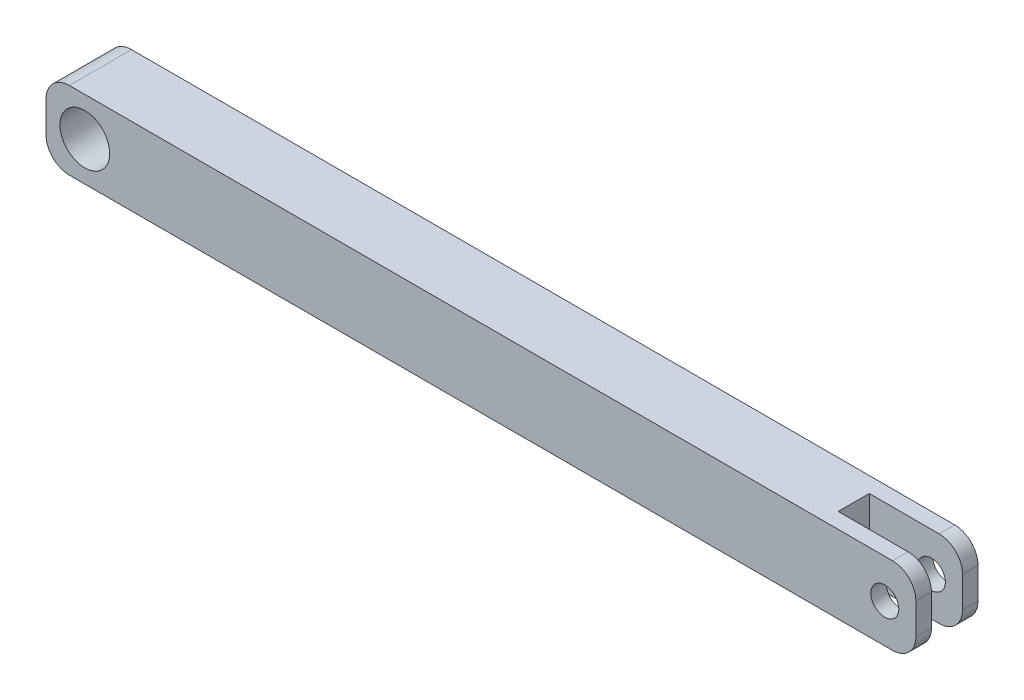
ISO-10303-21;
HEADER;
FILE_DESCRIPTION(('STEP AP214'),'2;1');
FILE_NAME('part.step','',(''),(''),'','','');
FILE_SCHEMA(('AUTOMOTIVE_DESIGN { 1 0 10303 214 1 1 1 1 }'));
ENDSEC;
DATA;
#1=APPLICATION_CONTEXT('core data for automotive mechanical design processes');
#2=APPLICATION_PROTOCOL_DEFINITION('international standard','automotive_design',2000,#1);
#3=PRODUCT_CONTEXT('',#1,'mechanical');
#4=PRODUCT('Part','Part','',(#3));
#5=PRODUCT_RELATED_PRODUCT_CATEGORY('part','',(#4));
#6=PRODUCT_DEFINITION_FORMATION('','',#4);
#7=PRODUCT_DEFINITION_CONTEXT('part definition',#1,'design');
#8=PRODUCT_DEFINITION('design','',#6,#7);
#9=PRODUCT_DEFINITION_SHAPE('','',#8);
#10=(LENGTH_UNIT() NAMED_UNIT(*) SI_UNIT(.MILLI.,.METRE.));
#11=(NAMED_UNIT(*) PLANE_ANGLE_UNIT() SI_UNIT($,.RADIAN.));
#12=(NAMED_UNIT(*) SI_UNIT($,.STERADIAN.) SOLID_ANGLE_UNIT());
#13=UNCERTAINTY_MEASURE_WITH_UNIT(LENGTH_MEASURE(1.E-05),#10,'distance_accuracy_value','');
#14=(GEOMETRIC_REPRESENTATION_CONTEXT(3) GLOBAL_UNCERTAINTY_ASSIGNED_CONTEXT((#13)) GLOBAL_UNIT_ASSIGNED_CONTEXT((#10,
#11,#12)) REPRESENTATION_CONTEXT('',''));
#15=CARTESIAN_POINT('',(0.,0.,0.));
#16=DIRECTION('',(0.,0.,1.));
#17=DIRECTION('',(1.,0.,0.));
#18=AXIS2_PLACEMENT_3D('',#15,#16,#17);
#19=CARTESIAN_POINT('',(56.,5.,3.));
#20=DIRECTION('',(-1.,0.,0.));
#21=DIRECTION('',(0.,0.,1.));
#22=AXIS2_PLACEMENT_3D('',#19,#20,#21);
#23=PLANE('',#22);
#24=DIRECTION('',(0.,0.,-1.));
#25=VECTOR('',#24,1.);
#26=CARTESIAN_POINT('',(56.,1.5,3.));
#27=LINE('',#26,#25);
#28=CARTESIAN_POINT('',(56.,1.5,3.5));
#29=VERTEX_POINT('',#28);
#30=CARTESIAN_POINT('',(56.,1.5,2.5));
#31=VERTEX_POINT('',#30);
#32=EDGE_CURVE('E254',#29,#31,#27,.T.);
#33=ORIENTED_EDGE('',*,*,#32,.T.);
#34=DIRECTION('',(0.,1.,0.));
#35=VECTOR('',#34,1.);
#36=CARTESIAN_POINT('',(56.,5.,2.5));
#37=LINE('',#36,#35);
#38=CARTESIAN_POINT('',(56.,3.5,2.5));
#39=VERTEX_POINT('',#38);
#40=EDGE_CURVE('E185',#31,#39,#37,.T.);
#41=ORIENTED_EDGE('',*,*,#40,.T.);
#42=DIRECTION('',(0.,0.,-1.));
#43=VECTOR('',#42,1.);
#44=CARTESIAN_POINT('',(56.,3.5,3.));
#45=LINE('',#44,#43);
#46=CARTESIAN_POINT('',(56.,3.5,3.5));
#47=VERTEX_POINT('',#46);
#48=EDGE_CURVE('E257',#39,#47,#45,.F.);
#49=ORIENTED_EDGE('',*,*,#48,.T.);
#50=DIRECTION('',(0.,1.,0.));
#51=VECTOR('',#50,1.);
#52=CARTESIAN_POINT('',(56.,1.5,3.5));
#53=LINE('',#52,#51);
#54=EDGE_CURVE('E232',#29,#47,#53,.T.);
#55=ORIENTED_EDGE('',*,*,#54,.F.);
#56=EDGE_LOOP('',(#33,#41,#49,#55));
#57=FACE_BOUND('',#56,.T.);
#58=ADVANCED_FACE('F41',(#57),#23,.F.);
#59=CARTESIAN_POINT('',(54.,2.5,3.001));
#60=DIRECTION('',(0.,0.,-1.));
#61=DIRECTION('',(-1.,0.,0.));
#62=AXIS2_PLACEMENT_3D('',#59,#60,#61);
#63=CYLINDRICAL_SURFACE('',#62,0.900000000000004);
#64=CARTESIAN_POINT('',(54.,2.5,2.5));
#65=DIRECTION('',(0.,0.,1.));
#66=DIRECTION('',(1.,0.,0.));
#67=AXIS2_PLACEMENT_3D('',#64,#65,#66);
#68=CIRCLE('',#67,0.900000000000004);
#69=CARTESIAN_POINT('',(53.1,2.5,2.5));
#70=VERTEX_POINT('',#69);
#71=EDGE_CURVE('E190',#70,#70,#68,.T.);
#72=CARTESIAN_POINT('',(54.,2.5,3.5));
#73=DIRECTION('',(0.,0.,1.));
#74=DIRECTION('',(1.,0.,0.));
#75=AXIS2_PLACEMENT_3D('',#72,#73,#74);
#76=CIRCLE('',#75,0.900000000000004);
#77=CARTESIAN_POINT('',(53.1,2.5,3.5));
#78=VERTEX_POINT('',#77);
#79=EDGE_CURVE('E223',#78,#78,#76,.T.);
#80=CARTESIAN_POINT('',(53.1,2.5,2.5));
#81=CARTESIAN_POINT('',(53.1,2.5,2.51041666666667));
#82=CARTESIAN_POINT('',(53.1,2.5,2.52083333333334));
#83=CARTESIAN_POINT('',(53.1,2.5,2.54166666666667));
#84=CARTESIAN_POINT('',(53.1,2.5,2.55208333333334));
#85=CARTESIAN_POINT('',(53.1,2.5,2.57291666666667));
#86=CARTESIAN_POINT('',(53.1,2.5,2.58333333333334));
#87=CARTESIAN_POINT('',(53.1,2.5,2.60416666666667));
#88=CARTESIAN_POINT('',(53.1,2.5,2.61458333333334));
#89=CARTESIAN_POINT('',(53.1,2.5,2.63541666666667));
#90=CARTESIAN_POINT('',(53.1,2.5,2.64583333333334));
#91=CARTESIAN_POINT('',(53.1,2.5,2.66666666666667));
#92=CARTESIAN_POINT('',(53.1,2.5,2.67708333333334));
#93=CARTESIAN_POINT('',(53.1,2.5,2.69791666666667));
#94=CARTESIAN_POINT('',(53.1,2.5,2.70833333333334));
#95=CARTESIAN_POINT('',(53.1,2.5,2.72916666666667));
#96=CARTESIAN_POINT('',(53.1,2.5,2.73958333333334));
#97=CARTESIAN_POINT('',(53.1,2.5,2.76041666666667));
#98=CARTESIAN_POINT('',(53.1,2.5,2.77083333333334));
#99=CARTESIAN_POINT('',(53.1,2.5,2.79166666666667));
#100=CARTESIAN_POINT('',(53.1,2.5,2.80208333333334));
#101=CARTESIAN_POINT('',(53.1,2.5,2.82291666666667));
#102=CARTESIAN_POINT('',(53.1,2.5,2.83333333333334));
#103=CARTESIAN_POINT('',(53.1,2.5,2.85416666666667));
#104=CARTESIAN_POINT('',(53.1,2.5,2.86458333333334));
#105=CARTESIAN_POINT('',(53.1,2.5,2.88541666666667));
#106=CARTESIAN_POINT('',(53.1,2.5,2.89583333333334));
#107=CARTESIAN_POINT('',(53.1,2.5,2.91666666666667));
#108=CARTESIAN_POINT('',(53.1,2.5,2.92708333333334));
#109=CARTESIAN_POINT('',(53.1,2.5,2.94791666666667));
#110=CARTESIAN_POINT('',(53.1,2.5,2.95833333333333));
#111=CARTESIAN_POINT('',(53.1,2.5,2.97916666666667));
#112=CARTESIAN_POINT('',(53.1,2.5,2.98958333333333));
#113=CARTESIAN_POINT('',(53.1,2.5,3.01041666666667));
#114=CARTESIAN_POINT('',(53.1,2.5,3.02083333333333));
#115=CARTESIAN_POINT('',(53.1,2.5,3.04166666666667));
#116=CARTESIAN_POINT('',(53.1,2.5,3.05208333333333));
#117=CARTESIAN_POINT('',(53.1,2.5,3.07291666666667));
#118=CARTESIAN_POINT('',(53.1,2.5,3.08333333333333));
#119=CARTESIAN_POINT('',(53.1,2.5,3.10416666666667));
#120=CARTESIAN_POINT('',(53.1,2.5,3.11458333333333));
#121=CARTESIAN_POINT('',(53.1,2.5,3.13541666666667));
#122=CARTESIAN_POINT('',(53.1,2.5,3.14583333333333));
#123=CARTESIAN_POINT('',(53.1,2.5,3.16666666666667));
#124=CARTESIAN_POINT('',(53.1,2.5,3.17708333333333));
#125=CARTESIAN_POINT('',(53.1,2.5,3.19791666666667));
#126=CARTESIAN_POINT('',(53.1,2.5,3.20833333333333));
#127=CARTESIAN_POINT('',(53.1,2.5,3.22916666666667));
#128=CARTESIAN_POINT('',(53.1,2.5,3.23958333333333));
#129=CARTESIAN_POINT('',(53.1,2.5,3.26041666666667));
#130=CARTESIAN_POINT('',(53.1,2.5,3.27083333333333));
#131=CARTESIAN_POINT('',(53.1,2.5,3.29166666666667));
#132=CARTESIAN_POINT('',(53.1,2.5,3.30208333333333));
#133=CARTESIAN_POINT('',(53.1,2.5,3.32291666666667));
#134=CARTESIAN_POINT('',(53.1,2.5,3.33333333333333));
#135=CARTESIAN_POINT('',(53.1,2.5,3.35416666666667));
#136=CARTESIAN_POINT('',(53.1,2.5,3.36458333333333));
#137=CARTESIAN_POINT('',(53.1,2.5,3.38541666666667));
#138=CARTESIAN_POINT('',(53.1,2.5,3.39583333333333));
#139=CARTESIAN_POINT('',(53.1,2.5,3.41666666666667));
#140=CARTESIAN_POINT('',(53.1,2.5,3.42708333333333));
#141=CARTESIAN_POINT('',(53.1,2.5,3.44791666666667));
#142=CARTESIAN_POINT('',(53.1,2.5,3.45833333333333));
#143=CARTESIAN_POINT('',(53.1,2.5,3.47916666666667));
#144=CARTESIAN_POINT('',(53.1,2.5,3.48958333333333));
#145=CARTESIAN_POINT('',(53.1,2.5,3.5));
#146=B_SPLINE_CURVE_WITH_KNOTS('',3,(#80,#81,#82,#83,#84,#85,#86,#87,#88,#89,#90,#91,#92,#93,
#94,#95,#96,#97,#98,#99,#100,#101,#102,#103,#104,#105,#106,#107,#108,#109,#110,#111,#112,#113,
#114,#115,#116,#117,#118,#119,#120,#121,#122,#123,#124,#125,#126,#127,#128,#129,#130,#131,#132,
#133,#134,#135,#136,#137,#138,#139,#140,#141,#142,#143,#144,#145),.UNSPECIFIED.,.F.,.F.,(4,2,2,
2,2,2,2,2,2,2,2,2,2,2,2,2,2,2,2,2,2,2,2,2,2,2,2,2,2,2,2,2,4),(0.,0.0312499999999996,
0.0624999999999996,0.0937499999999997,0.124999999999999,0.156249999999999,0.187499999999999,
0.218749999999999,0.249999999999999,0.281249999999999,0.312499999999999,0.343749999999999,
0.374999999999999,0.406249999999999,0.437499999999998,0.468749999999998,0.499999999999998,
0.531249999999998,0.562499999999998,0.593749999999998,0.624999999999998,0.656249999999998,
0.687499999999998,0.718749999999998,0.749999999999997,0.781249999999997,0.812499999999997,
0.843749999999997,0.874999999999997,0.906249999999997,0.937499999999996,0.968749999999997,
0.999999999999997),.UNSPECIFIED.);
#147=EDGE_CURVE('BSEAM320',#70,#78,#146,.T.);
#148=ORIENTED_EDGE('',*,*,#71,.F.);
#149=ORIENTED_EDGE('',*,*,#79,.T.);
#150=ORIENTED_EDGE('',*,*,#147,.T.);
#151=ORIENTED_EDGE('',*,*,#147,.F.);
#152=EDGE_LOOP('',(#148,#150,#149,#151));
#153=FACE_BOUND('',#152,.T.);
#154=ADVANCED_FACE('F320',(#153),#63,.F.);
#155=CARTESIAN_POINT('',(54.5,3.5,0.));
#156=DIRECTION('',(0.,0.,1.));
#157=DIRECTION('',(1.,0.,0.));
#158=AXIS2_PLACEMENT_3D('',#155,#156,#157);
#159=CYLINDRICAL_SURFACE('',#158,1.5);
#160=CARTESIAN_POINT('',(54.5,3.5,2.5));
#161=DIRECTION('',(0.,0.,1.));
#162=DIRECTION('',(1.,0.,0.));
#163=AXIS2_PLACEMENT_3D('',#160,#161,#162);
#164=CIRCLE('',#163,1.5);
#165=CARTESIAN_POINT('',(54.5,5.,2.5));
#166=VERTEX_POINT('',#165);
#167=EDGE_CURVE('E188',#166,#39,#164,.F.);
#168=ORIENTED_EDGE('',*,*,#167,.F.);
#169=DIRECTION('',(0.,0.,-1.));
#170=VECTOR('',#169,1.);
#171=CARTESIAN_POINT('',(54.5,5.,0.));
#172=LINE('',#171,#170);
#173=CARTESIAN_POINT('',(54.5,5.,3.5));
#174=VERTEX_POINT('',#173);
#175=EDGE_CURVE('E167',#174,#166,#172,.T.);
#176=ORIENTED_EDGE('',*,*,#175,.F.);
#177=CARTESIAN_POINT('',(54.5,3.5,3.5));
#178=DIRECTION('',(0.,0.,1.));
#179=DIRECTION('',(1.,0.,0.));
#180=AXIS2_PLACEMENT_3D('',#177,#178,#179);
#181=CIRCLE('',#180,1.5);
#182=EDGE_CURVE('E235',#47,#174,#181,.T.);
#183=ORIENTED_EDGE('',*,*,#182,.F.);
#184=ORIENTED_EDGE('',*,*,#48,.F.);
#185=EDGE_LOOP('',(#168,#176,#183,#184));
#186=FACE_BOUND('',#185,.T.);
#187=ADVANCED_FACE('F298',(#186),#159,.T.);
#188=CARTESIAN_POINT('',(54.5,1.5,3.));
#189=DIRECTION('',(0.,0.,-1.));
#190=DIRECTION('',(-1.,0.,0.));
#191=AXIS2_PLACEMENT_3D('',#188,#189,#190);
#192=CYLINDRICAL_SURFACE('',#191,1.5);
#193=CARTESIAN_POINT('',(54.5,1.5,2.5));
#194=DIRECTION('',(0.,0.,1.));
#195=DIRECTION('',(1.,0.,0.));
#196=AXIS2_PLACEMENT_3D('',#193,#194,#195);
#197=CIRCLE('',#196,1.5);
#198=CARTESIAN_POINT('',(54.5,0.,2.5));
#199=VERTEX_POINT('',#198);
#200=EDGE_CURVE('E183',#31,#199,#197,.F.);
#201=ORIENTED_EDGE('',*,*,#200,.F.);
#202=ORIENTED_EDGE('',*,*,#32,.F.);
#203=CARTESIAN_POINT('',(54.5,1.5,3.5));
#204=DIRECTION('',(0.,0.,1.));
#205=DIRECTION('',(1.,0.,0.));
#206=AXIS2_PLACEMENT_3D('',#203,#204,#205);
#207=CIRCLE('',#206,1.5);
#208=CARTESIAN_POINT('',(54.5,0.,3.5));
#209=VERTEX_POINT('',#208);
#210=EDGE_CURVE('E229',#209,#29,#207,.T.);
#211=ORIENTED_EDGE('',*,*,#210,.F.);
#212=DIRECTION('',(0.,0.,-1.));
#213=VECTOR('',#212,1.);
#214=CARTESIAN_POINT('',(54.5,0.,0.));
#215=LINE('',#214,#213);
#216=EDGE_CURVE('E55',#199,#209,#215,.F.);
#217=ORIENTED_EDGE('',*,*,#216,.F.);
#218=EDGE_LOOP('',(#201,#202,#211,#217));
#219=FACE_BOUND('',#218,.T.);
#220=ADVANCED_FACE('F292',(#219),#192,.T.);
#221=CARTESIAN_POINT('',(0.,5.,0.));
#222=DIRECTION('',(1.,0.,0.));
#223=DIRECTION('',(0.,0.,-1.));
#224=AXIS2_PLACEMENT_3D('',#221,#222,#223);
#225=PLANE('',#224);
#226=DIRECTION('',(0.,0.,1.));
#227=VECTOR('',#226,1.);
#228=CARTESIAN_POINT('',(0.,3.5,0.));
#229=LINE('',#228,#227);
#230=CARTESIAN_POINT('',(0.,3.5,3.5));
#231=VERTEX_POINT('',#230);
#232=CARTESIAN_POINT('',(0.,3.5,-0.5));
#233=VERTEX_POINT('',#232);
#234=EDGE_CURVE('E265',#231,#233,#229,.F.);
#235=ORIENTED_EDGE('',*,*,#234,.T.);
#236=DIRECTION('',(0.,1.,0.));
#237=VECTOR('',#236,1.);
#238=CARTESIAN_POINT('',(0.,1.5,-0.5));
#239=LINE('',#238,#237);
#240=CARTESIAN_POINT('',(0.,1.5,-0.5));
#241=VERTEX_POINT('',#240);
#242=EDGE_CURVE('E220',#241,#233,#239,.T.);
#243=ORIENTED_EDGE('',*,*,#242,.F.);
#244=DIRECTION('',(0.,0.,1.));
#245=VECTOR('',#244,1.);
#246=CARTESIAN_POINT('',(0.,1.5,0.));
#247=LINE('',#246,#245);
#248=CARTESIAN_POINT('',(0.,1.5,3.5));
#249=VERTEX_POINT('',#248);
#250=EDGE_CURVE('E267',#241,#249,#247,.T.);
#251=ORIENTED_EDGE('',*,*,#250,.T.);
#252=DIRECTION('',(0.,-1.,0.));
#253=VECTOR('',#252,1.);
#254=CARTESIAN_POINT('',(0.,3.5,3.5));
#255=LINE('',#254,#253);
#256=EDGE_CURVE('E244',#231,#249,#255,.T.);
#257=ORIENTED_EDGE('',*,*,#256,.F.);
#258=EDGE_LOOP('',(#235,#243,#251,#257));
#259=FACE_BOUND('',#258,.T.);
#260=ADVANCED_FACE('F310',(#259),#225,.F.);
#261=CARTESIAN_POINT('',(56.,3.5,-0.500000000000004));
#262=VERTEX_POINT('',#261);
#263=CARTESIAN_POINT('',(56.,3.5,0.5));
#264=VERTEX_POINT('',#263);
#265=EDGE_CURVE('E258',#262,#264,#45,.F.);
#266=ORIENTED_EDGE('',*,*,#265,.T.);
#267=DIRECTION('',(0.,-1.,0.));
#268=VECTOR('',#267,1.);
#269=CARTESIAN_POINT('',(56.,5.,0.5));
#270=LINE('',#269,#268);
#271=CARTESIAN_POINT('',(56.,1.5,0.5));
#272=VERTEX_POINT('',#271);
#273=EDGE_CURVE('E175',#264,#272,#270,.T.);
#274=ORIENTED_EDGE('',*,*,#273,.T.);
#275=CARTESIAN_POINT('',(56.,1.5,-0.500000000000004));
#276=VERTEX_POINT('',#275);
#277=EDGE_CURVE('E253',#272,#276,#27,.T.);
#278=ORIENTED_EDGE('',*,*,#277,.T.);
#279=DIRECTION('',(0.,-1.,0.));
#280=VECTOR('',#279,1.);
#281=CARTESIAN_POINT('',(56.,3.5,-0.500000000000004));
#282=LINE('',#281,#280);
#283=EDGE_CURVE('E208',#262,#276,#282,.T.);
#284=ORIENTED_EDGE('',*,*,#283,.F.);
#285=EDGE_LOOP('',(#266,#274,#278,#284));
#286=FACE_BOUND('',#285,.T.);
#287=ADVANCED_FACE('F277',(#286),#23,.F.);
#288=CARTESIAN_POINT('',(0.,5.,0.));
#289=DIRECTION('',(0.,1.,0.));
#290=DIRECTION('',(0.,0.,1.));
#291=AXIS2_PLACEMENT_3D('',#288,#289,#290);
#292=PLANE('',#291);
#293=DIRECTION('',(0.,0.,1.));
#294=VECTOR('',#293,1.);
#295=CARTESIAN_POINT('',(50.,5.,0.700000000000001));
#296=LINE('',#295,#294);
#297=CARTESIAN_POINT('',(50.,5.,0.500000000000001));
#298=VERTEX_POINT('',#297);
#299=CARTESIAN_POINT('',(50.,5.,2.5));
#300=VERTEX_POINT('',#299);
#301=EDGE_CURVE('E144',#298,#300,#296,.T.);
#302=ORIENTED_EDGE('',*,*,#301,.F.);
#303=DIRECTION('',(-1.,0.,0.));
#304=VECTOR('',#303,1.);
#305=CARTESIAN_POINT('',(56.8423004053584,5.,0.5));
#306=LINE('',#305,#304);
#307=CARTESIAN_POINT('',(54.5,5.,0.5));
#308=VERTEX_POINT('',#307);
#309=EDGE_CURVE('E162',#308,#298,#306,.T.);
#310=ORIENTED_EDGE('',*,*,#309,.F.);
#311=CARTESIAN_POINT('',(54.5,5.,-0.500000000000004));
#312=VERTEX_POINT('',#311);
#313=EDGE_CURVE('E251',#308,#312,#172,.T.);
#314=ORIENTED_EDGE('',*,*,#313,.T.);
#315=DIRECTION('',(1.,0.,0.));
#316=VECTOR('',#315,1.);
#317=CARTESIAN_POINT('',(1.5,5.,-0.5));
#318=LINE('',#317,#316);
#319=CARTESIAN_POINT('',(1.5,5.,-0.5));
#320=VERTEX_POINT('',#319);
#321=EDGE_CURVE('E202',#320,#312,#318,.T.);
#322=ORIENTED_EDGE('',*,*,#321,.F.);
#323=DIRECTION('',(0.,0.,1.));
#324=VECTOR('',#323,1.);
#325=CARTESIAN_POINT('',(1.5,5.,3.));
#326=LINE('',#325,#324);
#327=CARTESIAN_POINT('',(1.5,5.,3.5));
#328=VERTEX_POINT('',#327);
#329=EDGE_CURVE('E154',#320,#328,#326,.T.);
#330=ORIENTED_EDGE('',*,*,#329,.T.);
#331=DIRECTION('',(-1.,0.,0.));
#332=VECTOR('',#331,1.);
#333=CARTESIAN_POINT('',(54.5,5.,3.5));
#334=LINE('',#333,#332);
#335=EDGE_CURVE('E238',#174,#328,#334,.T.);
#336=ORIENTED_EDGE('',*,*,#335,.F.);
#337=ORIENTED_EDGE('',*,*,#175,.T.);
#338=DIRECTION('',(1.,0.,0.));
#339=VECTOR('',#338,1.);
#340=CARTESIAN_POINT('',(56.8423004053584,5.,2.5));
#341=LINE('',#340,#339);
#342=EDGE_CURVE('E160',#300,#166,#341,.T.);
#343=ORIENTED_EDGE('',*,*,#342,.F.);
#344=EDGE_LOOP('',(#302,#310,#314,#322,#330,#336,#337,#343));
#345=FACE_BOUND('',#344,.T.);
#346=ADVANCED_FACE('F165',(#345),#292,.T.);
#347=CARTESIAN_POINT('',(0.,0.,0.));
#348=DIRECTION('',(0.,1.,0.));
#349=DIRECTION('',(0.,0.,1.));
#350=AXIS2_PLACEMENT_3D('',#347,#348,#349);
#351=PLANE('',#350);
#352=DIRECTION('',(-1.,0.,0.));
#353=VECTOR('',#352,1.);
#354=CARTESIAN_POINT('',(0.,0.,0.500000000000007));
#355=LINE('',#354,#353);
#356=CARTESIAN_POINT('',(54.5,0.,0.5));
#357=VERTEX_POINT('',#356);
#358=CARTESIAN_POINT('',(50.,0.,0.500000000000001));
#359=VERTEX_POINT('',#358);
#360=EDGE_CURVE('E171',#357,#359,#355,.T.);
#361=ORIENTED_EDGE('',*,*,#360,.T.);
#362=DIRECTION('',(0.,0.,1.));
#363=VECTOR('',#362,1.);
#364=CARTESIAN_POINT('',(50.,0.,0.));
#365=LINE('',#364,#363);
#366=CARTESIAN_POINT('',(50.,0.,2.5));
#367=VERTEX_POINT('',#366);
#368=EDGE_CURVE('E269',#359,#367,#365,.T.);
#369=ORIENTED_EDGE('',*,*,#368,.T.);
#370=DIRECTION('',(1.,0.,0.));
#371=VECTOR('',#370,1.);
#372=CARTESIAN_POINT('',(0.,0.,2.50000000000001));
#373=LINE('',#372,#371);
#374=EDGE_CURVE('E11',#367,#199,#373,.T.);
#375=ORIENTED_EDGE('',*,*,#374,.T.);
#376=ORIENTED_EDGE('',*,*,#216,.T.);
#377=DIRECTION('',(1.,0.,0.));
#378=VECTOR('',#377,1.);
#379=CARTESIAN_POINT('',(1.5,0.,3.5));
#380=LINE('',#379,#378);
#381=CARTESIAN_POINT('',(1.5,0.,3.5));
#382=VERTEX_POINT('',#381);
#383=EDGE_CURVE('E155',#382,#209,#380,.T.);
#384=ORIENTED_EDGE('',*,*,#383,.F.);
#385=DIRECTION('',(0.,0.,1.));
#386=VECTOR('',#385,1.);
#387=CARTESIAN_POINT('',(1.5,0.,0.));
#388=LINE('',#387,#386);
#389=CARTESIAN_POINT('',(1.5,0.,-0.5));
#390=VERTEX_POINT('',#389);
#391=EDGE_CURVE('E63',#382,#390,#388,.F.);
#392=ORIENTED_EDGE('',*,*,#391,.T.);
#393=DIRECTION('',(-1.,0.,0.));
#394=VECTOR('',#393,1.);
#395=CARTESIAN_POINT('',(54.5,0.,-0.500000000000004));
#396=LINE('',#395,#394);
#397=CARTESIAN_POINT('',(54.5,0.,-0.500000000000004));
#398=VERTEX_POINT('',#397);
#399=EDGE_CURVE('E214',#398,#390,#396,.T.);
#400=ORIENTED_EDGE('',*,*,#399,.F.);
#401=EDGE_CURVE('E262',#398,#357,#215,.F.);
#402=ORIENTED_EDGE('',*,*,#401,.T.);
#403=EDGE_LOOP('',(#361,#369,#375,#376,#384,#392,#400,#402));
#404=FACE_BOUND('',#403,.T.);
#405=ADVANCED_FACE('F285',(#404),#351,.F.);
#406=CARTESIAN_POINT('',(2.5,2.5,-0.00100000000000013));
#407=DIRECTION('',(0.,0.,1.));
#408=DIRECTION('',(1.,0.,0.));
#409=AXIS2_PLACEMENT_3D('',#406,#407,#408);
#410=CYLINDRICAL_SURFACE('',#409,1.6);
#411=CARTESIAN_POINT('',(2.5,2.5,3.5));
#412=DIRECTION('',(0.,0.,1.));
#413=DIRECTION('',(1.,0.,0.));
#414=AXIS2_PLACEMENT_3D('',#411,#412,#413);
#415=CIRCLE('',#414,1.6);
#416=CARTESIAN_POINT('',(4.1,2.5,3.5));
#417=VERTEX_POINT('',#416);
#418=EDGE_CURVE('E226',#417,#417,#415,.T.);
#419=CARTESIAN_POINT('',(2.5,2.5,-0.5));
#420=DIRECTION('',(0.,0.,-1.));
#421=DIRECTION('',(-1.,0.,0.));
#422=AXIS2_PLACEMENT_3D('',#419,#420,#421);
#423=CIRCLE('',#422,1.6);
#424=CARTESIAN_POINT('',(4.1,2.5,-0.5));
#425=VERTEX_POINT('',#424);
#426=EDGE_CURVE('E193',#425,#425,#423,.T.);
#427=CARTESIAN_POINT('',(4.1,2.5,3.5));
#428=CARTESIAN_POINT('',(4.1,2.5,3.45833333333333));
#429=CARTESIAN_POINT('',(4.1,2.5,3.41666666666667));
#430=CARTESIAN_POINT('',(4.1,2.5,3.33333333333333));
#431=CARTESIAN_POINT('',(4.1,2.5,3.29166666666667));
#432=CARTESIAN_POINT('',(4.1,2.5,3.20833333333333));
#433=CARTESIAN_POINT('',(4.1,2.5,3.16666666666667));
#434=CARTESIAN_POINT('',(4.1,2.5,3.08333333333333));
#435=CARTESIAN_POINT('',(4.1,2.5,3.04166666666667));
#436=CARTESIAN_POINT('',(4.1,2.5,2.95833333333333));
#437=CARTESIAN_POINT('',(4.1,2.5,2.91666666666667));
#438=CARTESIAN_POINT('',(4.1,2.5,2.83333333333333));
#439=CARTESIAN_POINT('',(4.1,2.5,2.79166666666667));
#440=CARTESIAN_POINT('',(4.1,2.5,2.70833333333333));
#441=CARTESIAN_POINT('',(4.1,2.5,2.66666666666667));
#442=CARTESIAN_POINT('',(4.1,2.5,2.58333333333333));
#443=CARTESIAN_POINT('',(4.1,2.5,2.54166666666667));
#444=CARTESIAN_POINT('',(4.1,2.5,2.45833333333333));
#445=CARTESIAN_POINT('',(4.1,2.5,2.41666666666667));
#446=CARTESIAN_POINT('',(4.1,2.5,2.33333333333333));
#447=CARTESIAN_POINT('',(4.1,2.5,2.29166666666667));
#448=CARTESIAN_POINT('',(4.1,2.5,2.20833333333333));
#449=CARTESIAN_POINT('',(4.1,2.5,2.16666666666667));
#450=CARTESIAN_POINT('',(4.1,2.5,2.08333333333333));
#451=CARTESIAN_POINT('',(4.1,2.5,2.04166666666667));
#452=CARTESIAN_POINT('',(4.1,2.5,1.95833333333333));
#453=CARTESIAN_POINT('',(4.1,2.5,1.91666666666667));
#454=CARTESIAN_POINT('',(4.1,2.5,1.83333333333333));
#455=CARTESIAN_POINT('',(4.1,2.5,1.79166666666667));
#456=CARTESIAN_POINT('',(4.1,2.5,1.70833333333333));
#457=CARTESIAN_POINT('',(4.1,2.5,1.66666666666667));
#458=CARTESIAN_POINT('',(4.1,2.5,1.58333333333333));
#459=CARTESIAN_POINT('',(4.1,2.5,1.54166666666667));
#460=CARTESIAN_POINT('',(4.1,2.5,1.45833333333333));
#461=CARTESIAN_POINT('',(4.1,2.5,1.41666666666667));
#462=CARTESIAN_POINT('',(4.1,2.5,1.33333333333333));
#463=CARTESIAN_POINT('',(4.1,2.5,1.29166666666667));
#464=CARTESIAN_POINT('',(4.1,2.5,1.20833333333333));
#465=CARTESIAN_POINT('',(4.1,2.5,1.16666666666667));
#466=CARTESIAN_POINT('',(4.1,2.5,1.08333333333333));
#467=CARTESIAN_POINT('',(4.1,2.5,1.04166666666667));
#468=CARTESIAN_POINT('',(4.1,2.5,0.958333333333333));
#469=CARTESIAN_POINT('',(4.1,2.5,0.916666666666666));
#470=CARTESIAN_POINT('',(4.1,2.5,0.833333333333333));
#471=CARTESIAN_POINT('',(4.1,2.5,0.791666666666666));
#472=CARTESIAN_POINT('',(4.1,2.5,0.708333333333333));
#473=CARTESIAN_POINT('',(4.1,2.5,0.666666666666666));
#474=CARTESIAN_POINT('',(4.1,2.5,0.583333333333333));
#475=CARTESIAN_POINT('',(4.1,2.5,0.541666666666666));
#476=CARTESIAN_POINT('',(4.1,2.5,0.458333333333333));
#477=CARTESIAN_POINT('',(4.1,2.5,0.416666666666666));
#478=CARTESIAN_POINT('',(4.1,2.5,0.333333333333333));
#479=CARTESIAN_POINT('',(4.1,2.5,0.291666666666666));
#480=CARTESIAN_POINT('',(4.1,2.5,0.208333333333333));
#481=CARTESIAN_POINT('',(4.1,2.5,0.166666666666666));
#482=CARTESIAN_POINT('',(4.1,2.5,0.083333333333333));
#483=CARTESIAN_POINT('',(4.1,2.5,0.0416666666666663));
#484=CARTESIAN_POINT('',(4.1,2.5,-0.0416666666666671));
#485=CARTESIAN_POINT('',(4.1,2.5,-0.0833333333333338));
#486=CARTESIAN_POINT('',(4.1,2.5,-0.166666666666667));
#487=CARTESIAN_POINT('',(4.1,2.5,-0.208333333333334));
#488=CARTESIAN_POINT('',(4.1,2.5,-0.291666666666667));
#489=CARTESIAN_POINT('',(4.1,2.5,-0.333333333333334));
#490=CARTESIAN_POINT('',(4.1,2.5,-0.416666666666667));
#491=CARTESIAN_POINT('',(4.1,2.5,-0.458333333333334));
#492=CARTESIAN_POINT('',(4.1,2.5,-0.5));
#493=B_SPLINE_CURVE_WITH_KNOTS('',3,(#427,#428,#429,#430,#431,#432,#433,#434,#435,#436,#437,
#438,#439,#440,#441,#442,#443,#444,#445,#446,#447,#448,#449,#450,#451,#452,#453,#454,#455,#456,
#457,#458,#459,#460,#461,#462,#463,#464,#465,#466,#467,#468,#469,#470,#471,#472,#473,#474,#475,
#476,#477,#478,#479,#480,#481,#482,#483,#484,#485,#486,#487,#488,#489,#490,#491,#492),
.UNSPECIFIED.,.F.,.F.,(4,2,2,2,2,2,2,2,2,2,2,2,2,2,2,2,2,2,2,2,2,2,2,2,2,2,2,2,2,2,2,2,4),(0.,
0.125,0.25,0.375,0.5,0.625,0.75,0.875,1.,1.125,1.25,1.375,1.5,1.625,1.75,1.875,2.,2.125,2.25,
2.375,2.5,2.625,2.75,2.875,3.,3.125,3.25,3.375,3.5,3.625,3.75,3.875,4.),.UNSPECIFIED.);
#494=EDGE_CURVE('BSEAM346',#417,#425,#493,.T.);
#495=ORIENTED_EDGE('',*,*,#418,.T.);
#496=ORIENTED_EDGE('',*,*,#426,.T.);
#497=ORIENTED_EDGE('',*,*,#494,.T.);
#498=ORIENTED_EDGE('',*,*,#494,.F.);
#499=EDGE_LOOP('',(#495,#497,#496,#498));
#500=FACE_BOUND('',#499,.T.);
#501=ADVANCED_FACE('F346',(#500),#410,.F.);
#502=CARTESIAN_POINT('',(54.,2.5,0.5));
#503=DIRECTION('',(0.,0.,-1.));
#504=DIRECTION('',(-1.,0.,0.));
#505=AXIS2_PLACEMENT_3D('',#502,#503,#504);
#506=CIRCLE('',#505,0.900000000000004);
#507=CARTESIAN_POINT('',(53.1,2.5,0.500000000000001));
#508=VERTEX_POINT('',#507);
#509=EDGE_CURVE('E180',#508,#508,#506,.T.);
#510=CARTESIAN_POINT('',(54.,2.5,-0.500000000000004));
#511=DIRECTION('',(0.,0.,-1.));
#512=DIRECTION('',(-1.,0.,0.));
#513=AXIS2_PLACEMENT_3D('',#510,#511,#512);
#514=CIRCLE('',#513,0.900000000000004);
#515=CARTESIAN_POINT('',(53.1,2.5,-0.500000000000003));
#516=VERTEX_POINT('',#515);
#517=EDGE_CURVE('E196',#516,#516,#514,.T.);
#518=CARTESIAN_POINT('',(53.1,2.5,0.500000000000001));
#519=CARTESIAN_POINT('',(53.1,2.5,0.489583333333334));
#520=CARTESIAN_POINT('',(53.1,2.5,0.479166666666668));
#521=CARTESIAN_POINT('',(53.1,2.5,0.458333333333334));
#522=CARTESIAN_POINT('',(53.1,2.5,0.447916666666667));
#523=CARTESIAN_POINT('',(53.1,2.5,0.427083333333334));
#524=CARTESIAN_POINT('',(53.1,2.5,0.416666666666667));
#525=CARTESIAN_POINT('',(53.1,2.5,0.395833333333334));
#526=CARTESIAN_POINT('',(53.1,2.5,0.385416666666667));
#527=CARTESIAN_POINT('',(53.1,2.5,0.364583333333334));
#528=CARTESIAN_POINT('',(53.1,2.5,0.354166666666667));
#529=CARTESIAN_POINT('',(53.1,2.5,0.333333333333333));
#530=CARTESIAN_POINT('',(53.1,2.5,0.322916666666667));
#531=CARTESIAN_POINT('',(53.1,2.5,0.302083333333333));
#532=CARTESIAN_POINT('',(53.1,2.5,0.291666666666666));
#533=CARTESIAN_POINT('',(53.1,2.5,0.270833333333333));
#534=CARTESIAN_POINT('',(53.1,2.5,0.260416666666666));
#535=CARTESIAN_POINT('',(53.1,2.5,0.239583333333333));
#536=CARTESIAN_POINT('',(53.1,2.5,0.229166666666666));
#537=CARTESIAN_POINT('',(53.1,2.5,0.208333333333333));
#538=CARTESIAN_POINT('',(53.1,2.5,0.197916666666666));
#539=CARTESIAN_POINT('',(53.1,2.5,0.177083333333333));
#540=CARTESIAN_POINT('',(53.1,2.5,0.166666666666666));
#541=CARTESIAN_POINT('',(53.1,2.5,0.145833333333333));
#542=CARTESIAN_POINT('',(53.1,2.5,0.135416666666666));
#543=CARTESIAN_POINT('',(53.1,2.5,0.114583333333333));
#544=CARTESIAN_POINT('',(53.1,2.5,0.104166666666666));
#545=CARTESIAN_POINT('',(53.1,2.5,0.0833333333333324));
#546=CARTESIAN_POINT('',(53.1,2.5,0.0729166666666656));
#547=CARTESIAN_POINT('',(53.1,2.5,0.0520833333333321));
#548=CARTESIAN_POINT('',(53.1,2.5,0.0416666666666654));
#549=CARTESIAN_POINT('',(53.1,2.5,0.020833333333332));
#550=CARTESIAN_POINT('',(53.1,2.5,0.0104166666666654));
#551=CARTESIAN_POINT('',(53.1,2.5,-0.010416666666668));
#552=CARTESIAN_POINT('',(53.1,2.5,-0.0208333333333347));
#553=CARTESIAN_POINT('',(53.1,2.5,-0.041666666666668));
#554=CARTESIAN_POINT('',(53.1,2.5,-0.0520833333333347));
#555=CARTESIAN_POINT('',(53.1,2.5,-0.0729166666666682));
#556=CARTESIAN_POINT('',(53.1,2.5,-0.083333333333335));
#557=CARTESIAN_POINT('',(53.1,2.5,-0.104166666666668));
#558=CARTESIAN_POINT('',(53.1,2.5,-0.114583333333335));
#559=CARTESIAN_POINT('',(53.1,2.5,-0.135416666666669));
#560=CARTESIAN_POINT('',(53.1,2.5,-0.145833333333335));
#561=CARTESIAN_POINT('',(53.1,2.5,-0.166666666666669));
#562=CARTESIAN_POINT('',(53.1,2.5,-0.177083333333336));
#563=CARTESIAN_POINT('',(53.1,2.5,-0.197916666666669));
#564=CARTESIAN_POINT('',(53.1,2.5,-0.208333333333336));
#565=CARTESIAN_POINT('',(53.1,2.5,-0.229166666666669));
#566=CARTESIAN_POINT('',(53.1,2.5,-0.239583333333336));
#567=CARTESIAN_POINT('',(53.1,2.5,-0.260416666666669));
#568=CARTESIAN_POINT('',(53.1,2.5,-0.270833333333336));
#569=CARTESIAN_POINT('',(53.1,2.5,-0.291666666666669));
#570=CARTESIAN_POINT('',(53.1,2.5,-0.302083333333336));
#571=CARTESIAN_POINT('',(53.1,2.5,-0.322916666666669));
#572=CARTESIAN_POINT('',(53.1,2.5,-0.333333333333336));
#573=CARTESIAN_POINT('',(53.1,2.5,-0.35416666666667));
#574=CARTESIAN_POINT('',(53.1,2.5,-0.364583333333336));
#575=CARTESIAN_POINT('',(53.1,2.5,-0.38541666666667));
#576=CARTESIAN_POINT('',(53.1,2.5,-0.395833333333336));
#577=CARTESIAN_POINT('',(53.1,2.5,-0.41666666666667));
#578=CARTESIAN_POINT('',(53.1,2.5,-0.427083333333337));
#579=CARTESIAN_POINT('',(53.1,2.5,-0.44791666666667));
#580=CARTESIAN_POINT('',(53.1,2.5,-0.458333333333337));
#581=CARTESIAN_POINT('',(53.1,2.5,-0.47916666666667));
#582=CARTESIAN_POINT('',(53.1,2.5,-0.489583333333337));
#583=CARTESIAN_POINT('',(53.1,2.5,-0.500000000000003));
#584=B_SPLINE_CURVE_WITH_KNOTS('',3,(#518,#519,#520,#521,#522,#523,#524,#525,#526,#527,#528,
#529,#530,#531,#532,#533,#534,#535,#536,#537,#538,#539,#540,#541,#542,#543,#544,#545,#546,#547,
#548,#549,#550,#551,#552,#553,#554,#555,#556,#557,#558,#559,#560,#561,#562,#563,#564,#565,#566,
#567,#568,#569,#570,#571,#572,#573,#574,#575,#576,#577,#578,#579,#580,#581,#582,#583),
.UNSPECIFIED.,.F.,.F.,(4,2,2,2,2,2,2,2,2,2,2,2,2,2,2,2,2,2,2,2,2,2,2,2,2,2,2,2,2,2,2,2,4),(0.,
0.03125,0.0625000000000001,0.0937500000000005,0.125000000000001,0.156250000000001,
0.187500000000001,0.218750000000001,0.250000000000001,0.281250000000001,0.312500000000001,
0.343750000000002,0.375000000000002,0.406250000000002,0.437500000000002,0.468750000000002,
0.500000000000002,0.531250000000002,0.562500000000002,0.593750000000003,0.625000000000003,
0.656250000000003,0.687500000000003,0.718750000000003,0.750000000000003,0.781250000000003,
0.812500000000003,0.843750000000004,0.875000000000004,0.906250000000004,0.937500000000004,
0.968750000000004,1.),.UNSPECIFIED.);
#585=EDGE_CURVE('BSEAM328',#508,#516,#584,.T.);
#586=ORIENTED_EDGE('',*,*,#509,.F.);
#587=ORIENTED_EDGE('',*,*,#517,.T.);
#588=ORIENTED_EDGE('',*,*,#585,.T.);
#589=ORIENTED_EDGE('',*,*,#585,.F.);
#590=EDGE_LOOP('',(#586,#588,#587,#589));
#591=FACE_BOUND('',#590,.T.);
#592=ADVANCED_FACE('F328',(#591),#63,.F.);
#593=CARTESIAN_POINT('',(54.5,3.5,0.5));
#594=DIRECTION('',(0.,0.,-1.));
#595=DIRECTION('',(-1.,0.,0.));
#596=AXIS2_PLACEMENT_3D('',#593,#594,#595);
#597=CIRCLE('',#596,1.5);
#598=EDGE_CURVE('E178',#264,#308,#597,.F.);
#599=ORIENTED_EDGE('',*,*,#598,.F.);
#600=ORIENTED_EDGE('',*,*,#265,.F.);
#601=CARTESIAN_POINT('',(54.5,3.5,-0.500000000000004));
#602=DIRECTION('',(0.,0.,-1.));
#603=DIRECTION('',(-1.,0.,0.));
#604=AXIS2_PLACEMENT_3D('',#601,#602,#603);
#605=CIRCLE('',#604,1.5);
#606=EDGE_CURVE('E205',#312,#262,#605,.T.);
#607=ORIENTED_EDGE('',*,*,#606,.F.);
#608=ORIENTED_EDGE('',*,*,#313,.F.);
#609=EDGE_LOOP('',(#599,#600,#607,#608));
#610=FACE_BOUND('',#609,.T.);
#611=ADVANCED_FACE('F303',(#610),#159,.T.);
#612=CARTESIAN_POINT('',(54.5,1.5,0.5));
#613=DIRECTION('',(0.,0.,-1.));
#614=DIRECTION('',(-1.,0.,0.));
#615=AXIS2_PLACEMENT_3D('',#612,#613,#614);
#616=CIRCLE('',#615,1.5);
#617=EDGE_CURVE('E49',#357,#272,#616,.F.);
#618=ORIENTED_EDGE('',*,*,#617,.F.);
#619=ORIENTED_EDGE('',*,*,#401,.F.);
#620=CARTESIAN_POINT('',(54.5,1.5,-0.500000000000004));
#621=DIRECTION('',(0.,0.,-1.));
#622=DIRECTION('',(-1.,0.,0.));
#623=AXIS2_PLACEMENT_3D('',#620,#621,#622);
#624=CIRCLE('',#623,1.5);
#625=EDGE_CURVE('E211',#276,#398,#624,.T.);
#626=ORIENTED_EDGE('',*,*,#625,.F.);
#627=ORIENTED_EDGE('',*,*,#277,.F.);
#628=EDGE_LOOP('',(#618,#619,#626,#627));
#629=FACE_BOUND('',#628,.T.);
#630=ADVANCED_FACE('F280',(#629),#192,.T.);
#631=CARTESIAN_POINT('',(1.5,1.5,0.));
#632=DIRECTION('',(0.,0.,1.));
#633=DIRECTION('',(1.,0.,0.));
#634=AXIS2_PLACEMENT_3D('',#631,#632,#633);
#635=CYLINDRICAL_SURFACE('',#634,1.5);
#636=ORIENTED_EDGE('',*,*,#250,.F.);
#637=CARTESIAN_POINT('',(1.5,1.5,-0.5));
#638=DIRECTION('',(0.,0.,-1.));
#639=DIRECTION('',(-1.,0.,0.));
#640=AXIS2_PLACEMENT_3D('',#637,#638,#639);
#641=CIRCLE('',#640,1.5);
#642=EDGE_CURVE('E217',#390,#241,#641,.T.);
#643=ORIENTED_EDGE('',*,*,#642,.F.);
#644=ORIENTED_EDGE('',*,*,#391,.F.);
#645=CARTESIAN_POINT('',(1.5,1.5,3.5));
#646=DIRECTION('',(0.,0.,1.));
#647=DIRECTION('',(1.,0.,0.));
#648=AXIS2_PLACEMENT_3D('',#645,#646,#647);
#649=CIRCLE('',#648,1.5);
#650=EDGE_CURVE('E247',#249,#382,#649,.T.);
#651=ORIENTED_EDGE('',*,*,#650,.F.);
#652=EDGE_LOOP('',(#636,#643,#644,#651));
#653=FACE_BOUND('',#652,.T.);
#654=ADVANCED_FACE('F311',(#653),#635,.T.);
#655=CARTESIAN_POINT('',(1.5,3.5,0.));
#656=DIRECTION('',(0.,0.,-1.));
#657=DIRECTION('',(-1.,0.,0.));
#658=AXIS2_PLACEMENT_3D('',#655,#656,#657);
#659=CYLINDRICAL_SURFACE('',#658,1.5);
#660=ORIENTED_EDGE('',*,*,#329,.F.);
#661=CARTESIAN_POINT('',(1.5,3.5,-0.5));
#662=DIRECTION('',(0.,0.,-1.));
#663=DIRECTION('',(-1.,0.,0.));
#664=AXIS2_PLACEMENT_3D('',#661,#662,#663);
#665=CIRCLE('',#664,1.5);
#666=EDGE_CURVE('E199',#233,#320,#665,.T.);
#667=ORIENTED_EDGE('',*,*,#666,.F.);
#668=ORIENTED_EDGE('',*,*,#234,.F.);
#669=CARTESIAN_POINT('',(1.5,3.5,3.5));
#670=DIRECTION('',(0.,0.,1.));
#671=DIRECTION('',(1.,0.,0.));
#672=AXIS2_PLACEMENT_3D('',#669,#670,#671);
#673=CIRCLE('',#672,1.5);
#674=EDGE_CURVE('E241',#328,#231,#673,.T.);
#675=ORIENTED_EDGE('',*,*,#674,.F.);
#676=EDGE_LOOP('',(#660,#667,#668,#675));
#677=FACE_BOUND('',#676,.T.);
#678=ADVANCED_FACE('F43',(#677),#659,.T.);
#679=CARTESIAN_POINT('',(50.,-5.,0.700000000000001));
#680=DIRECTION('',(-1.,0.,0.));
#681=DIRECTION('',(0.,0.,1.));
#682=AXIS2_PLACEMENT_3D('',#679,#680,#681);
#683=PLANE('',#682);
#684=ORIENTED_EDGE('',*,*,#368,.F.);
#685=DIRECTION('',(0.,1.,0.));
#686=VECTOR('',#685,1.);
#687=CARTESIAN_POINT('',(50.,-5.,0.500000000000001));
#688=LINE('',#687,#686);
#689=EDGE_CURVE('E149',#359,#298,#688,.T.);
#690=ORIENTED_EDGE('',*,*,#689,.T.);
#691=ORIENTED_EDGE('',*,*,#301,.T.);
#692=DIRECTION('',(0.,1.,0.));
#693=VECTOR('',#692,1.);
#694=CARTESIAN_POINT('',(50.,-5.,2.5));
#695=LINE('',#694,#693);
#696=EDGE_CURVE('E147',#367,#300,#695,.T.);
#697=ORIENTED_EDGE('',*,*,#696,.F.);
#698=EDGE_LOOP('',(#684,#690,#691,#697));
#699=FACE_BOUND('',#698,.T.);
#700=ADVANCED_FACE('F146',(#699),#683,.F.);
#701=CARTESIAN_POINT('',(54.5,1.5,3.5));
#702=DIRECTION('',(0.,0.,1.));
#703=DIRECTION('',(1.,0.,0.));
#704=AXIS2_PLACEMENT_3D('',#701,#702,#703);
#705=PLANE('',#704);
#706=ORIENTED_EDGE('',*,*,#418,.F.);
#707=EDGE_LOOP('',(#706));
#708=FACE_BOUND('',#707,.T.);
#709=ORIENTED_EDGE('',*,*,#210,.T.);
#710=ORIENTED_EDGE('',*,*,#54,.T.);
#711=ORIENTED_EDGE('',*,*,#182,.T.);
#712=ORIENTED_EDGE('',*,*,#335,.T.);
#713=ORIENTED_EDGE('',*,*,#674,.T.);
#714=ORIENTED_EDGE('',*,*,#256,.T.);
#715=ORIENTED_EDGE('',*,*,#650,.T.);
#716=ORIENTED_EDGE('',*,*,#383,.T.);
#717=EDGE_LOOP('',(#709,#710,#711,#712,#713,#714,#715,#716));
#718=FACE_BOUND('',#717,.T.);
#719=ORIENTED_EDGE('',*,*,#79,.F.);
#720=EDGE_LOOP('',(#719));
#721=FACE_BOUND('',#720,.T.);
#722=ADVANCED_FACE('F288',(#708,#718,#721),#705,.T.);
#723=CARTESIAN_POINT('',(1.5,3.5,-0.5));
#724=DIRECTION('',(0.,0.,-1.));
#725=DIRECTION('',(-1.,0.,0.));
#726=AXIS2_PLACEMENT_3D('',#723,#724,#725);
#727=PLANE('',#726);
#728=ORIENTED_EDGE('',*,*,#517,.F.);
#729=EDGE_LOOP('',(#728));
#730=FACE_BOUND('',#729,.T.);
#731=ORIENTED_EDGE('',*,*,#666,.T.);
#732=ORIENTED_EDGE('',*,*,#321,.T.);
#733=ORIENTED_EDGE('',*,*,#606,.T.);
#734=ORIENTED_EDGE('',*,*,#283,.T.);
#735=ORIENTED_EDGE('',*,*,#625,.T.);
#736=ORIENTED_EDGE('',*,*,#399,.T.);
#737=ORIENTED_EDGE('',*,*,#642,.T.);
#738=ORIENTED_EDGE('',*,*,#242,.T.);
#739=EDGE_LOOP('',(#731,#732,#733,#734,#735,#736,#737,#738));
#740=FACE_BOUND('',#739,.T.);
#741=ORIENTED_EDGE('',*,*,#426,.F.);
#742=EDGE_LOOP('',(#741));
#743=FACE_BOUND('',#742,.T.);
#744=ADVANCED_FACE('F283',(#730,#740,#743),#727,.T.);
#745=CARTESIAN_POINT('',(56.8423004053584,-5.,0.5));
#746=DIRECTION('',(0.,0.,-1.));
#747=DIRECTION('',(-1.,0.,0.));
#748=AXIS2_PLACEMENT_3D('',#745,#746,#747);
#749=PLANE('',#748);
#750=ORIENTED_EDGE('',*,*,#509,.T.);
#751=EDGE_LOOP('',(#750));
#752=FACE_BOUND('',#751,.T.);
#753=ORIENTED_EDGE('',*,*,#598,.T.);
#754=ORIENTED_EDGE('',*,*,#309,.T.);
#755=ORIENTED_EDGE('',*,*,#689,.F.);
#756=ORIENTED_EDGE('',*,*,#360,.F.);
#757=ORIENTED_EDGE('',*,*,#617,.T.);
#758=ORIENTED_EDGE('',*,*,#273,.F.);
#759=EDGE_LOOP('',(#753,#754,#755,#756,#757,#758));
#760=FACE_BOUND('',#759,.T.);
#761=ADVANCED_FACE('F272',(#752,#760),#749,.F.);
#762=CARTESIAN_POINT('',(56.8423004053584,-5.,2.5));
#763=DIRECTION('',(0.,0.,1.));
#764=DIRECTION('',(1.,0.,0.));
#765=AXIS2_PLACEMENT_3D('',#762,#763,#764);
#766=PLANE('',#765);
#767=ORIENTED_EDGE('',*,*,#71,.T.);
#768=EDGE_LOOP('',(#767));
#769=FACE_BOUND('',#768,.T.);
#770=ORIENTED_EDGE('',*,*,#167,.T.);
#771=ORIENTED_EDGE('',*,*,#40,.F.);
#772=ORIENTED_EDGE('',*,*,#200,.T.);
#773=ORIENTED_EDGE('',*,*,#374,.F.);
#774=ORIENTED_EDGE('',*,*,#696,.T.);
#775=ORIENTED_EDGE('',*,*,#342,.T.);
#776=EDGE_LOOP('',(#770,#771,#772,#773,#774,#775));
#777=FACE_BOUND('',#776,.T.);
#778=ADVANCED_FACE('F159',(#769,#777),#766,.F.);
#779=CLOSED_SHELL('',(#58,#154,#187,#220,#260,#287,#346,#405,#501,#592,#611,#630,#654,#678,#700,
#722,#744,#761,#778));
#780=MANIFOLD_SOLID_BREP('B2',#779);
#781=ADVANCED_BREP_SHAPE_REPRESENTATION('',(#18,#780),#14);
#782=SHAPE_DEFINITION_REPRESENTATION(#9,#781);
ENDSEC;
END-ISO-10303-21;
